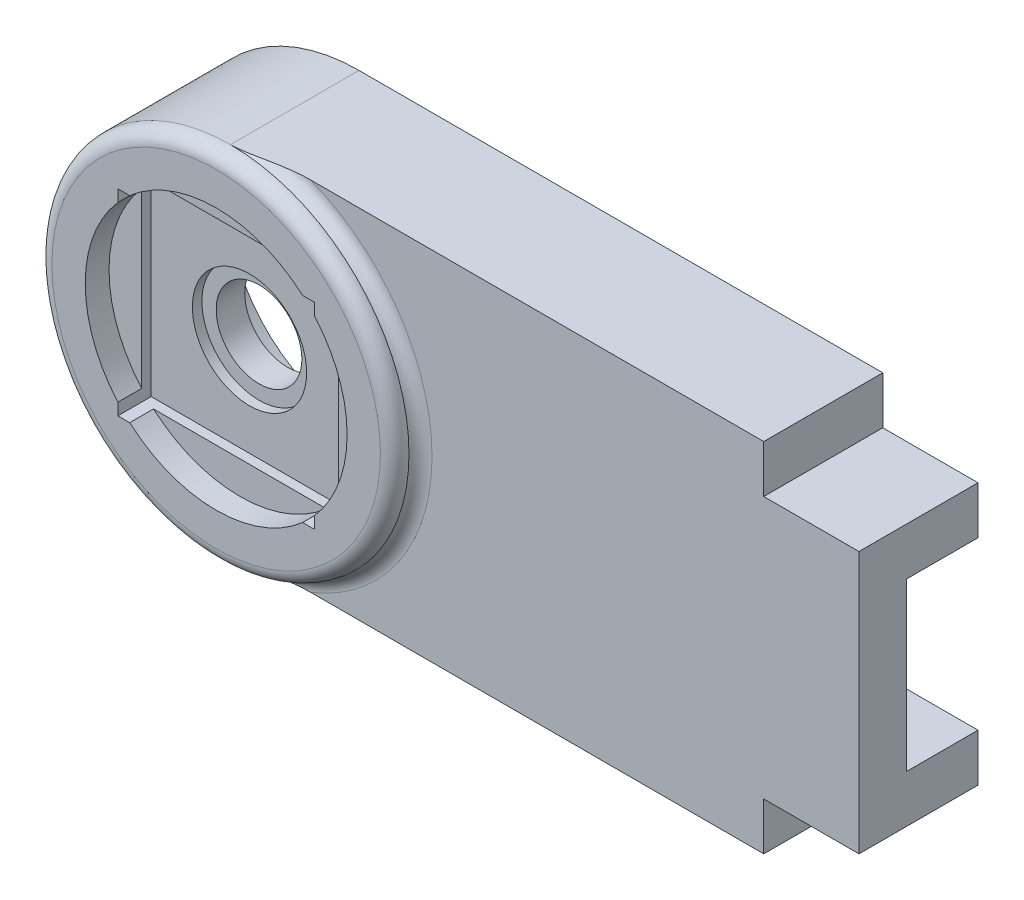
ISO-10303-21;
HEADER;
FILE_DESCRIPTION(('STEP AP214'),'2;1');
FILE_NAME('part.step','',(''),(''),'','','');
FILE_SCHEMA(('AUTOMOTIVE_DESIGN { 1 0 10303 214 1 1 1 1 }'));
ENDSEC;
DATA;
#1=APPLICATION_CONTEXT('core data for automotive mechanical design processes');
#2=APPLICATION_PROTOCOL_DEFINITION('international standard','automotive_design',2000,#1);
#3=PRODUCT_CONTEXT('',#1,'mechanical');
#4=PRODUCT('Part','Part','',(#3));
#5=PRODUCT_RELATED_PRODUCT_CATEGORY('part','',(#4));
#6=PRODUCT_DEFINITION_FORMATION('','',#4);
#7=PRODUCT_DEFINITION_CONTEXT('part definition',#1,'design');
#8=PRODUCT_DEFINITION('design','',#6,#7);
#9=PRODUCT_DEFINITION_SHAPE('','',#8);
#10=(LENGTH_UNIT() NAMED_UNIT(*) SI_UNIT(.MILLI.,.METRE.));
#11=(NAMED_UNIT(*) PLANE_ANGLE_UNIT() SI_UNIT($,.RADIAN.));
#12=(NAMED_UNIT(*) SI_UNIT($,.STERADIAN.) SOLID_ANGLE_UNIT());
#13=UNCERTAINTY_MEASURE_WITH_UNIT(LENGTH_MEASURE(1.E-05),#10,'distance_accuracy_value','');
#14=(GEOMETRIC_REPRESENTATION_CONTEXT(3) GLOBAL_UNCERTAINTY_ASSIGNED_CONTEXT((#13)) GLOBAL_UNIT_ASSIGNED_CONTEXT((#10,
#11,#12)) REPRESENTATION_CONTEXT('',''));
#15=CARTESIAN_POINT('',(0.,0.,0.));
#16=DIRECTION('',(0.,0.,1.));
#17=DIRECTION('',(1.,0.,0.));
#18=AXIS2_PLACEMENT_3D('',#15,#16,#17);
#19=CARTESIAN_POINT('',(0.,0.,30.));
#20=DIRECTION('',(0.,0.,1.));
#21=DIRECTION('',(1.,0.,0.));
#22=AXIS2_PLACEMENT_3D('',#19,#20,#21);
#23=PLANE('',#22);
#24=CARTESIAN_POINT('',(0.,0.,30.));
#25=DIRECTION('',(0.,0.,1.));
#26=DIRECTION('',(1.,0.,0.));
#27=AXIS2_PLACEMENT_3D('',#24,#25,#26);
#28=CIRCLE('',#27,34.5);
#29=CARTESIAN_POINT('',(34.5,0.,30.));
#30=VERTEX_POINT('',#29);
#31=EDGE_CURVE('E448',#30,#30,#28,.T.);
#32=ORIENTED_EDGE('',*,*,#31,.T.);
#33=EDGE_LOOP('',(#32));
#34=FACE_BOUND('',#33,.T.);
#35=DIRECTION('',(-1.,0.,0.));
#36=VECTOR('',#35,1.);
#37=CARTESIAN_POINT('',(-20.65,20.65,30.));
#38=LINE('',#37,#36);
#39=CARTESIAN_POINT('',(20.65,20.65,30.));
#40=VERTEX_POINT('',#39);
#41=CARTESIAN_POINT('',(18.1611535977206,20.65,30.));
#42=VERTEX_POINT('',#41);
#43=EDGE_CURVE('E274',#40,#42,#38,.T.);
#44=ORIENTED_EDGE('',*,*,#43,.F.);
#45=DIRECTION('',(0.,1.,0.));
#46=VECTOR('',#45,1.);
#47=CARTESIAN_POINT('',(20.65,-20.65,30.));
#48=LINE('',#47,#46);
#49=CARTESIAN_POINT('',(20.65,18.1611535977206,30.));
#50=VERTEX_POINT('',#49);
#51=EDGE_CURVE('E244',#50,#40,#48,.T.);
#52=ORIENTED_EDGE('',*,*,#51,.F.);
#53=CARTESIAN_POINT('',(0.,0.,30.));
#54=DIRECTION('',(0.,0.,1.));
#55=DIRECTION('',(1.,0.,0.));
#56=AXIS2_PLACEMENT_3D('',#53,#54,#55);
#57=CIRCLE('',#56,27.5);
#58=CARTESIAN_POINT('',(20.65,-18.1611535977206,30.));
#59=VERTEX_POINT('',#58);
#60=EDGE_CURVE('E311',#59,#50,#57,.T.);
#61=ORIENTED_EDGE('',*,*,#60,.F.);
#62=CARTESIAN_POINT('',(20.65,-20.65,30.));
#63=VERTEX_POINT('',#62);
#64=EDGE_CURVE('E271',#63,#59,#48,.T.);
#65=ORIENTED_EDGE('',*,*,#64,.F.);
#66=DIRECTION('',(1.,0.,0.));
#67=VECTOR('',#66,1.);
#68=CARTESIAN_POINT('',(-20.65,-20.65,30.));
#69=LINE('',#68,#67);
#70=CARTESIAN_POINT('',(18.1611535977206,-20.65,30.));
#71=VERTEX_POINT('',#70);
#72=EDGE_CURVE('E279',#71,#63,#69,.T.);
#73=ORIENTED_EDGE('',*,*,#72,.F.);
#74=CARTESIAN_POINT('',(-18.1611535977206,-20.65,30.));
#75=VERTEX_POINT('',#74);
#76=EDGE_CURVE('E314',#75,#71,#57,.T.);
#77=ORIENTED_EDGE('',*,*,#76,.F.);
#78=CARTESIAN_POINT('',(-20.65,-20.65,30.));
#79=VERTEX_POINT('',#78);
#80=EDGE_CURVE('E280',#79,#75,#69,.T.);
#81=ORIENTED_EDGE('',*,*,#80,.F.);
#82=DIRECTION('',(0.,-1.,0.));
#83=VECTOR('',#82,1.);
#84=CARTESIAN_POINT('',(-20.65,-20.65,30.));
#85=LINE('',#84,#83);
#86=CARTESIAN_POINT('',(-20.65,-18.1611535977206,30.));
#87=VERTEX_POINT('',#86);
#88=EDGE_CURVE('E276',#87,#79,#85,.T.);
#89=ORIENTED_EDGE('',*,*,#88,.F.);
#90=CARTESIAN_POINT('',(-20.65,18.1611535977206,30.));
#91=VERTEX_POINT('',#90);
#92=EDGE_CURVE('E939',#91,#87,#57,.T.);
#93=ORIENTED_EDGE('',*,*,#92,.F.);
#94=CARTESIAN_POINT('',(-20.65,20.65,30.));
#95=VERTEX_POINT('',#94);
#96=EDGE_CURVE('E277',#95,#91,#85,.T.);
#97=ORIENTED_EDGE('',*,*,#96,.F.);
#98=CARTESIAN_POINT('',(-18.1611535977206,20.65,30.));
#99=VERTEX_POINT('',#98);
#100=EDGE_CURVE('E273',#99,#95,#38,.T.);
#101=ORIENTED_EDGE('',*,*,#100,.F.);
#102=EDGE_CURVE('E316',#42,#99,#57,.T.);
#103=ORIENTED_EDGE('',*,*,#102,.F.);
#104=EDGE_LOOP('',(#44,#52,#61,#65,#73,#77,#81,#89,#93,#97,#101,#103));
#105=FACE_BOUND('',#104,.T.);
#106=ADVANCED_FACE('F41',(#34,#105),#23,.T.);
#107=CARTESIAN_POINT('',(0.,0.,30.));
#108=DIRECTION('',(0.,0.,-1.));
#109=DIRECTION('',(-1.,0.,0.));
#110=AXIS2_PLACEMENT_3D('',#107,#108,#109);
#111=CYLINDRICAL_SURFACE('',#110,27.5);
#112=ORIENTED_EDGE('',*,*,#60,.T.);
#113=DIRECTION('',(0.,0.,-1.));
#114=VECTOR('',#113,1.);
#115=CARTESIAN_POINT('',(20.65,18.1611535977206,30.));
#116=LINE('',#115,#114);
#117=CARTESIAN_POINT('',(20.65,18.1611535977206,25.));
#118=VERTEX_POINT('',#117);
#119=EDGE_CURVE('E307',#50,#118,#116,.T.);
#120=ORIENTED_EDGE('',*,*,#119,.T.);
#121=CARTESIAN_POINT('',(0.,0.,25.));
#122=DIRECTION('',(0.,0.,1.));
#123=DIRECTION('',(1.,0.,0.));
#124=AXIS2_PLACEMENT_3D('',#121,#122,#123);
#125=CIRCLE('',#124,27.5);
#126=CARTESIAN_POINT('',(20.65,-18.1611535977206,25.));
#127=VERTEX_POINT('',#126);
#128=EDGE_CURVE('E310',#127,#118,#125,.T.);
#129=ORIENTED_EDGE('',*,*,#128,.F.);
#130=DIRECTION('',(0.,0.,-1.));
#131=VECTOR('',#130,1.);
#132=CARTESIAN_POINT('',(20.65,-18.1611535977206,30.));
#133=LINE('',#132,#131);
#134=EDGE_CURVE('E304',#127,#59,#133,.F.);
#135=ORIENTED_EDGE('',*,*,#134,.T.);
#136=EDGE_LOOP('',(#112,#120,#129,#135));
#137=FACE_BOUND('',#136,.T.);
#138=ADVANCED_FACE('F480',(#137),#111,.F.);
#139=ORIENTED_EDGE('',*,*,#102,.T.);
#140=DIRECTION('',(0.,0.,-1.));
#141=VECTOR('',#140,1.);
#142=CARTESIAN_POINT('',(-18.1611535977206,20.65,30.));
#143=LINE('',#142,#141);
#144=CARTESIAN_POINT('',(-18.1611535977206,20.65,25.));
#145=VERTEX_POINT('',#144);
#146=EDGE_CURVE('E301',#99,#145,#143,.T.);
#147=ORIENTED_EDGE('',*,*,#146,.T.);
#148=CARTESIAN_POINT('',(18.1611535977206,20.65,25.));
#149=VERTEX_POINT('',#148);
#150=EDGE_CURVE('E315',#149,#145,#125,.T.);
#151=ORIENTED_EDGE('',*,*,#150,.F.);
#152=DIRECTION('',(0.,0.,-1.));
#153=VECTOR('',#152,1.);
#154=CARTESIAN_POINT('',(18.1611535977206,20.65,30.));
#155=LINE('',#154,#153);
#156=EDGE_CURVE('E298',#149,#42,#155,.F.);
#157=ORIENTED_EDGE('',*,*,#156,.T.);
#158=EDGE_LOOP('',(#139,#147,#151,#157));
#159=FACE_BOUND('',#158,.T.);
#160=ADVANCED_FACE('F486',(#159),#111,.F.);
#161=ORIENTED_EDGE('',*,*,#92,.T.);
#162=DIRECTION('',(0.,0.,-1.));
#163=VECTOR('',#162,1.);
#164=CARTESIAN_POINT('',(-20.65,-18.1611535977206,30.));
#165=LINE('',#164,#163);
#166=CARTESIAN_POINT('',(-20.65,-18.1611535977206,25.));
#167=VERTEX_POINT('',#166);
#168=EDGE_CURVE('E295',#87,#167,#165,.T.);
#169=ORIENTED_EDGE('',*,*,#168,.T.);
#170=CARTESIAN_POINT('',(-20.65,18.1611535977206,25.));
#171=VERTEX_POINT('',#170);
#172=EDGE_CURVE('E933',#171,#167,#125,.T.);
#173=ORIENTED_EDGE('',*,*,#172,.F.);
#174=DIRECTION('',(0.,0.,-1.));
#175=VECTOR('',#174,1.);
#176=CARTESIAN_POINT('',(-20.65,18.1611535977206,30.));
#177=LINE('',#176,#175);
#178=EDGE_CURVE('E292',#171,#91,#177,.F.);
#179=ORIENTED_EDGE('',*,*,#178,.T.);
#180=EDGE_LOOP('',(#161,#169,#173,#179));
#181=FACE_BOUND('',#180,.T.);
#182=ADVANCED_FACE('F650',(#181),#111,.F.);
#183=ORIENTED_EDGE('',*,*,#76,.T.);
#184=DIRECTION('',(0.,0.,-1.));
#185=VECTOR('',#184,1.);
#186=CARTESIAN_POINT('',(18.1611535977206,-20.65,30.));
#187=LINE('',#186,#185);
#188=CARTESIAN_POINT('',(18.1611535977206,-20.65,25.));
#189=VERTEX_POINT('',#188);
#190=EDGE_CURVE('E289',#71,#189,#187,.T.);
#191=ORIENTED_EDGE('',*,*,#190,.T.);
#192=CARTESIAN_POINT('',(-18.1611535977206,-20.65,25.));
#193=VERTEX_POINT('',#192);
#194=EDGE_CURVE('E319',#193,#189,#125,.T.);
#195=ORIENTED_EDGE('',*,*,#194,.F.);
#196=DIRECTION('',(0.,0.,-1.));
#197=VECTOR('',#196,1.);
#198=CARTESIAN_POINT('',(-18.1611535977206,-20.65,30.));
#199=LINE('',#198,#197);
#200=EDGE_CURVE('E247',#193,#75,#199,.F.);
#201=ORIENTED_EDGE('',*,*,#200,.T.);
#202=EDGE_LOOP('',(#183,#191,#195,#201));
#203=FACE_BOUND('',#202,.T.);
#204=ADVANCED_FACE('F489',(#203),#111,.F.);
#205=CARTESIAN_POINT('',(0.,0.,25.));
#206=DIRECTION('',(0.,0.,1.));
#207=DIRECTION('',(1.,0.,0.));
#208=AXIS2_PLACEMENT_3D('',#205,#206,#207);
#209=PLANE('',#208);
#210=ORIENTED_EDGE('',*,*,#128,.T.);
#211=DIRECTION('',(0.,-1.,0.));
#212=VECTOR('',#211,1.);
#213=CARTESIAN_POINT('',(20.65,0.,25.));
#214=LINE('',#213,#212);
#215=EDGE_CURVE('E445',#118,#127,#214,.T.);
#216=ORIENTED_EDGE('',*,*,#215,.T.);
#217=EDGE_LOOP('',(#210,#216));
#218=FACE_BOUND('',#217,.T.);
#219=ADVANCED_FACE('F529',(#218),#209,.T.);
#220=ORIENTED_EDGE('',*,*,#150,.T.);
#221=DIRECTION('',(1.,0.,0.));
#222=VECTOR('',#221,1.);
#223=CARTESIAN_POINT('',(0.,20.65,25.));
#224=LINE('',#223,#222);
#225=EDGE_CURVE('E442',#145,#149,#224,.T.);
#226=ORIENTED_EDGE('',*,*,#225,.T.);
#227=EDGE_LOOP('',(#220,#226));
#228=FACE_BOUND('',#227,.T.);
#229=ADVANCED_FACE('F631',(#228),#209,.T.);
#230=ORIENTED_EDGE('',*,*,#172,.T.);
#231=DIRECTION('',(0.,1.,0.));
#232=VECTOR('',#231,1.);
#233=CARTESIAN_POINT('',(-20.65,0.,25.));
#234=LINE('',#233,#232);
#235=EDGE_CURVE('E439',#167,#171,#234,.T.);
#236=ORIENTED_EDGE('',*,*,#235,.T.);
#237=EDGE_LOOP('',(#230,#236));
#238=FACE_BOUND('',#237,.T.);
#239=ADVANCED_FACE('F623',(#238),#209,.T.);
#240=ORIENTED_EDGE('',*,*,#194,.T.);
#241=DIRECTION('',(-1.,0.,0.));
#242=VECTOR('',#241,1.);
#243=CARTESIAN_POINT('',(0.,-20.65,25.));
#244=LINE('',#243,#242);
#245=EDGE_CURVE('E436',#189,#193,#244,.T.);
#246=ORIENTED_EDGE('',*,*,#245,.T.);
#247=EDGE_LOOP('',(#240,#246));
#248=FACE_BOUND('',#247,.T.);
#249=ADVANCED_FACE('F530',(#248),#209,.T.);
#250=CARTESIAN_POINT('',(130.,0.,25.));
#251=DIRECTION('',(-1.,0.,0.));
#252=DIRECTION('',(0.,0.,1.));
#253=AXIS2_PLACEMENT_3D('',#250,#251,#252);
#254=PLANE('',#253);
#255=DIRECTION('',(0.,0.,-1.));
#256=VECTOR('',#255,1.);
#257=CARTESIAN_POINT('',(130.,-17.5,15.));
#258=LINE('',#257,#256);
#259=CARTESIAN_POINT('',(130.,-17.5,15.));
#260=VERTEX_POINT('',#259);
#261=CARTESIAN_POINT('',(130.,-17.5,0.));
#262=VERTEX_POINT('',#261);
#263=EDGE_CURVE('E366',#260,#262,#258,.T.);
#264=ORIENTED_EDGE('',*,*,#263,.F.);
#265=DIRECTION('',(0.,-1.,0.));
#266=VECTOR('',#265,1.);
#267=CARTESIAN_POINT('',(130.,0.,15.));
#268=LINE('',#267,#266);
#269=CARTESIAN_POINT('',(130.,17.5,15.));
#270=VERTEX_POINT('',#269);
#271=EDGE_CURVE('E334',#270,#260,#268,.T.);
#272=ORIENTED_EDGE('',*,*,#271,.F.);
#273=DIRECTION('',(0.,0.,-1.));
#274=VECTOR('',#273,1.);
#275=CARTESIAN_POINT('',(130.,17.5,15.));
#276=LINE('',#275,#274);
#277=CARTESIAN_POINT('',(130.,17.5,0.));
#278=VERTEX_POINT('',#277);
#279=EDGE_CURVE('E368',#270,#278,#276,.T.);
#280=ORIENTED_EDGE('',*,*,#279,.T.);
#281=DIRECTION('',(0.,1.,0.));
#282=VECTOR('',#281,1.);
#283=CARTESIAN_POINT('',(130.,0.,0.));
#284=LINE('',#283,#282);
#285=CARTESIAN_POINT('',(130.,27.5,0.));
#286=VERTEX_POINT('',#285);
#287=EDGE_CURVE('E407',#278,#286,#284,.T.);
#288=ORIENTED_EDGE('',*,*,#287,.T.);
#289=DIRECTION('',(0.,0.,-1.));
#290=VECTOR('',#289,1.);
#291=CARTESIAN_POINT('',(130.,27.5,25.));
#292=LINE('',#291,#290);
#293=CARTESIAN_POINT('',(130.,27.5,25.));
#294=VERTEX_POINT('',#293);
#295=EDGE_CURVE('E419',#294,#286,#292,.T.);
#296=ORIENTED_EDGE('',*,*,#295,.F.);
#297=DIRECTION('',(0.,1.,0.));
#298=VECTOR('',#297,1.);
#299=CARTESIAN_POINT('',(130.,0.,25.));
#300=LINE('',#299,#298);
#301=CARTESIAN_POINT('',(130.,-27.5,25.));
#302=VERTEX_POINT('',#301);
#303=EDGE_CURVE('E388',#302,#294,#300,.T.);
#304=ORIENTED_EDGE('',*,*,#303,.F.);
#305=DIRECTION('',(0.,0.,-1.));
#306=VECTOR('',#305,1.);
#307=CARTESIAN_POINT('',(130.,-27.5,25.));
#308=LINE('',#307,#306);
#309=CARTESIAN_POINT('',(130.,-27.5,0.));
#310=VERTEX_POINT('',#309);
#311=EDGE_CURVE('E422',#302,#310,#308,.T.);
#312=ORIENTED_EDGE('',*,*,#311,.T.);
#313=EDGE_CURVE('E408',#310,#262,#284,.T.);
#314=ORIENTED_EDGE('',*,*,#313,.T.);
#315=EDGE_LOOP('',(#264,#272,#280,#288,#296,#304,#312,#314));
#316=FACE_BOUND('',#315,.T.);
#317=ADVANCED_FACE('F533',(#316),#254,.F.);
#318=CARTESIAN_POINT('',(0.,0.,0.));
#319=DIRECTION('',(0.,0.,1.));
#320=DIRECTION('',(1.,0.,0.));
#321=AXIS2_PLACEMENT_3D('',#318,#319,#320);
#322=PLANE('',#321);
#323=DIRECTION('',(1.,0.,0.));
#324=VECTOR('',#323,1.);
#325=CARTESIAN_POINT('',(0.,-17.5,0.));
#326=LINE('',#325,#324);
#327=CARTESIAN_POINT('',(93.2784913729705,-17.5,0.));
#328=VERTEX_POINT('',#327);
#329=EDGE_CURVE('E356',#328,#262,#326,.T.);
#330=ORIENTED_EDGE('',*,*,#329,.T.);
#331=ORIENTED_EDGE('',*,*,#313,.F.);
#332=DIRECTION('',(1.,0.,0.));
#333=VECTOR('',#332,1.);
#334=CARTESIAN_POINT('',(0.,-27.5,0.));
#335=LINE('',#334,#333);
#336=CARTESIAN_POINT('',(110.,-27.5,0.));
#337=VERTEX_POINT('',#336);
#338=EDGE_CURVE('E405',#337,#310,#335,.T.);
#339=ORIENTED_EDGE('',*,*,#338,.F.);
#340=DIRECTION('',(0.,1.,0.));
#341=VECTOR('',#340,1.);
#342=CARTESIAN_POINT('',(110.,0.,0.));
#343=LINE('',#342,#341);
#344=CARTESIAN_POINT('',(110.,-37.5,0.));
#345=VERTEX_POINT('',#344);
#346=EDGE_CURVE('E403',#345,#337,#343,.T.);
#347=ORIENTED_EDGE('',*,*,#346,.F.);
#348=DIRECTION('',(1.,0.,0.));
#349=VECTOR('',#348,1.);
#350=CARTESIAN_POINT('',(0.,-37.5,0.));
#351=LINE('',#350,#349);
#352=CARTESIAN_POINT('',(0.,-37.5,0.));
#353=VERTEX_POINT('',#352);
#354=EDGE_CURVE('E401',#353,#345,#351,.T.);
#355=ORIENTED_EDGE('',*,*,#354,.F.);
#356=CARTESIAN_POINT('',(0.,0.,0.));
#357=DIRECTION('',(0.,0.,1.));
#358=DIRECTION('',(1.,0.,0.));
#359=AXIS2_PLACEMENT_3D('',#356,#357,#358);
#360=CIRCLE('',#359,37.5);
#361=CARTESIAN_POINT('',(0.,37.5,0.));
#362=VERTEX_POINT('',#361);
#363=EDGE_CURVE('E399',#362,#353,#360,.T.);
#364=ORIENTED_EDGE('',*,*,#363,.F.);
#365=DIRECTION('',(1.,0.,0.));
#366=VECTOR('',#365,1.);
#367=CARTESIAN_POINT('',(0.,37.5,0.));
#368=LINE('',#367,#366);
#369=CARTESIAN_POINT('',(110.,37.5,0.));
#370=VERTEX_POINT('',#369);
#371=EDGE_CURVE('E363',#362,#370,#368,.T.);
#372=ORIENTED_EDGE('',*,*,#371,.T.);
#373=DIRECTION('',(0.,-1.,0.));
#374=VECTOR('',#373,1.);
#375=CARTESIAN_POINT('',(110.,0.,0.));
#376=LINE('',#375,#374);
#377=CARTESIAN_POINT('',(110.,27.5,0.));
#378=VERTEX_POINT('',#377);
#379=EDGE_CURVE('E382',#370,#378,#376,.T.);
#380=ORIENTED_EDGE('',*,*,#379,.T.);
#381=DIRECTION('',(1.,0.,0.));
#382=VECTOR('',#381,1.);
#383=CARTESIAN_POINT('',(0.,27.5,0.));
#384=LINE('',#383,#382);
#385=EDGE_CURVE('E411',#378,#286,#384,.T.);
#386=ORIENTED_EDGE('',*,*,#385,.T.);
#387=ORIENTED_EDGE('',*,*,#287,.F.);
#388=DIRECTION('',(1.,0.,0.));
#389=VECTOR('',#388,1.);
#390=CARTESIAN_POINT('',(0.,17.5,0.));
#391=LINE('',#390,#389);
#392=CARTESIAN_POINT('',(93.2784913729705,17.5,0.));
#393=VERTEX_POINT('',#392);
#394=EDGE_CURVE('E354',#393,#278,#391,.T.);
#395=ORIENTED_EDGE('',*,*,#394,.F.);
#396=DIRECTION('',(0.,1.,0.));
#397=VECTOR('',#396,1.);
#398=CARTESIAN_POINT('',(93.2784913729705,0.,0.));
#399=LINE('',#398,#397);
#400=CARTESIAN_POINT('',(93.2784913729705,27.5,0.));
#401=VERTEX_POINT('',#400);
#402=EDGE_CURVE('E351',#393,#401,#399,.T.);
#403=ORIENTED_EDGE('',*,*,#402,.T.);
#404=DIRECTION('',(-1.,0.,0.));
#405=VECTOR('',#404,1.);
#406=CARTESIAN_POINT('',(0.,27.5,0.));
#407=LINE('',#406,#405);
#408=CARTESIAN_POINT('',(0.,27.5,0.));
#409=VERTEX_POINT('',#408);
#410=EDGE_CURVE('E348',#401,#409,#407,.T.);
#411=ORIENTED_EDGE('',*,*,#410,.T.);
#412=CARTESIAN_POINT('',(0.,0.,0.));
#413=DIRECTION('',(0.,0.,-1.));
#414=DIRECTION('',(-1.,0.,0.));
#415=AXIS2_PLACEMENT_3D('',#412,#413,#414);
#416=CIRCLE('',#415,27.5);
#417=CARTESIAN_POINT('',(0.,-27.5,0.));
#418=VERTEX_POINT('',#417);
#419=EDGE_CURVE('E345',#418,#409,#416,.T.);
#420=ORIENTED_EDGE('',*,*,#419,.F.);
#421=DIRECTION('',(-1.,0.,0.));
#422=VECTOR('',#421,1.);
#423=CARTESIAN_POINT('',(0.,-27.5,0.));
#424=LINE('',#423,#422);
#425=CARTESIAN_POINT('',(93.2784913729705,-27.5,0.));
#426=VERTEX_POINT('',#425);
#427=EDGE_CURVE('E343',#426,#418,#424,.T.);
#428=ORIENTED_EDGE('',*,*,#427,.F.);
#429=DIRECTION('',(0.,-1.,0.));
#430=VECTOR('',#429,1.);
#431=CARTESIAN_POINT('',(93.2784913729705,0.,0.));
#432=LINE('',#431,#430);
#433=EDGE_CURVE('E324',#328,#426,#432,.T.);
#434=ORIENTED_EDGE('',*,*,#433,.F.);
#435=EDGE_LOOP('',(#330,#331,#339,#347,#355,#364,#372,#380,#386,#387,#395,#403,#411,#420,#428,#434));
#436=FACE_BOUND('',#435,.T.);
#437=ADVANCED_FACE('F464',(#436),#322,.F.);
#438=CARTESIAN_POINT('',(0.,37.5,25.));
#439=DIRECTION('',(0.,1.,0.));
#440=DIRECTION('',(-1.,0.,0.));
#441=AXIS2_PLACEMENT_3D('',#438,#439,#440);
#442=PLANE('',#441);
#443=ORIENTED_EDGE('',*,*,#371,.F.);
#444=DIRECTION('',(0.,0.,-1.));
#445=VECTOR('',#444,1.);
#446=CARTESIAN_POINT('',(0.,37.5,25.));
#447=LINE('',#446,#445);
#448=CARTESIAN_POINT('',(0.,37.5,27.));
#449=VERTEX_POINT('',#448);
#450=EDGE_CURVE('E434',#449,#362,#447,.T.);
#451=ORIENTED_EDGE('',*,*,#450,.F.);
#452=CARTESIAN_POINT('',(0.,37.5,27.));
#453=CARTESIAN_POINT('',(0.126964958034356,37.5,27.0000241727563));
#454=CARTESIAN_POINT('',(0.25392489725668,37.5,26.9981765764675));
#455=CARTESIAN_POINT('',(0.507721254466847,37.5,26.9909186121942));
#456=CARTESIAN_POINT('',(0.634557690329701,37.5,26.9855088743921));
#457=CARTESIAN_POINT('',(0.887879385580948,37.5,26.971316190933));
#458=CARTESIAN_POINT('',(1.01436488594792,37.5,26.9625374895175));
#459=CARTESIAN_POINT('',(1.26708875439398,37.5,26.9419211269181));
#460=CARTESIAN_POINT('',(1.39332711071027,37.5,26.9300833235392));
#461=CARTESIAN_POINT('',(1.770766185565,37.5,26.8906148384615));
#462=CARTESIAN_POINT('',(2.02154845620435,37.5,26.8589762546335));
#463=CARTESIAN_POINT('',(2.52201407534946,37.5,26.7879974706273));
#464=CARTESIAN_POINT('',(2.77169726830816,37.5,26.7486562140256));
#465=CARTESIAN_POINT('',(3.27009042281657,37.5,26.6648865159639));
#466=CARTESIAN_POINT('',(3.51880074289227,37.5,26.6204601766811));
#467=CARTESIAN_POINT('',(4.0156088464877,37.5,26.5285038337744));
#468=CARTESIAN_POINT('',(4.26370669786256,37.5,26.4809741916016));
#469=CARTESIAN_POINT('',(4.75987815313978,37.5,26.3842461450559));
#470=CARTESIAN_POINT('',(5.007951383345,37.5,26.3350458386594));
#471=CARTESIAN_POINT('',(5.50400147970555,37.5,26.236170017078));
#472=CARTESIAN_POINT('',(5.75197834597351,37.5,26.1864945024504));
#473=CARTESIAN_POINT('',(6.36431603926136,37.5,26.0643876456565));
#474=CARTESIAN_POINT('',(6.728728714026,37.5,25.9922078275736));
#475=CARTESIAN_POINT('',(7.45816353191382,37.5,25.8510775703508));
#476=CARTESIAN_POINT('',(7.82318566015714,37.5,25.7821270535276));
#477=CARTESIAN_POINT('',(8.91898998745693,37.5,25.5830939214297));
#478=CARTESIAN_POINT('',(9.65124633378456,37.5,25.460674544682));
#479=CARTESIAN_POINT('',(10.7541209749748,37.5,25.302961450623));
#480=CARTESIAN_POINT('',(11.1228690058357,37.5,25.2546741102408));
#481=CARTESIAN_POINT('',(11.8615607442197,37.5,25.1687428689242));
#482=CARTESIAN_POINT('',(12.2315042509846,37.5,25.1310972661956));
#483=CARTESIAN_POINT('',(12.9735330504083,37.5,25.0685336775709));
#484=CARTESIAN_POINT('',(13.3456214357148,37.5,25.0436510305308));
#485=CARTESIAN_POINT('',(13.904388199767,37.5,25.0179559297192));
#486=CARTESIAN_POINT('',(14.0908043820616,37.5,25.0113288041689));
#487=CARTESIAN_POINT('',(14.4637581153145,37.5,25.0023543165655));
#488=CARTESIAN_POINT('',(14.6502956770965,37.5,25.0000074110248));
#489=CARTESIAN_POINT('',(14.8368471838179,37.5,25.));
#490=B_SPLINE_CURVE_WITH_KNOTS('',3,(#452,#453,#454,#455,#456,#457,#458,#459,#460,#461,#462,
#463,#464,#465,#466,#467,#468,#469,#470,#471,#472,#473,#474,#475,#476,#477,#478,#479,#480,#481,
#482,#483,#484,#485,#486,#487,#488,#489),.UNSPECIFIED.,.F.,.F.,(4,2,2,2,2,2,2,2,2,2,2,2,2,2,2,2,
2,2,4),(0.,0.380873332337587,0.761679302040282,1.14200709657276,1.52235257291137,
2.28046840558012,3.0386882869685,3.79659584410962,4.55441528239082,5.31312849223086,
6.07184081274041,7.18630426002195,8.30074088427303,10.5273573186106,11.6429217734111,
12.7583077294945,13.8767655857452,14.4363236122891,14.995941315729),.UNSPECIFIED.);
#491=CARTESIAN_POINT('',(14.8368471838179,37.5,25.));
#492=VERTEX_POINT('',#491);
#493=EDGE_CURVE('E54',#449,#492,#490,.T.);
#494=ORIENTED_EDGE('',*,*,#493,.T.);
#495=DIRECTION('',(1.,0.,0.));
#496=VECTOR('',#495,1.);
#497=CARTESIAN_POINT('',(0.,37.5,25.));
#498=LINE('',#497,#496);
#499=CARTESIAN_POINT('',(110.,37.5,25.));
#500=VERTEX_POINT('',#499);
#501=EDGE_CURVE('E379',#492,#500,#498,.T.);
#502=ORIENTED_EDGE('',*,*,#501,.T.);
#503=DIRECTION('',(0.,0.,-1.));
#504=VECTOR('',#503,1.);
#505=CARTESIAN_POINT('',(110.,37.5,25.));
#506=LINE('',#505,#504);
#507=EDGE_CURVE('E396',#500,#370,#506,.T.);
#508=ORIENTED_EDGE('',*,*,#507,.T.);
#509=EDGE_LOOP('',(#443,#451,#494,#502,#508));
#510=FACE_BOUND('',#509,.T.);
#511=ADVANCED_FACE('F459',(#510),#442,.T.);
#512=CARTESIAN_POINT('',(0.,0.,25.));
#513=DIRECTION('',(0.,0.,-1.));
#514=DIRECTION('',(-1.,0.,0.));
#515=AXIS2_PLACEMENT_3D('',#512,#513,#514);
#516=CYLINDRICAL_SURFACE('',#515,37.5);
#517=CARTESIAN_POINT('',(0.,0.,27.));
#518=DIRECTION('',(0.,0.,1.));
#519=DIRECTION('',(1.,0.,0.));
#520=AXIS2_PLACEMENT_3D('',#517,#518,#519);
#521=CIRCLE('',#520,37.5);
#522=CARTESIAN_POINT('',(0.,-37.5,27.));
#523=VERTEX_POINT('',#522);
#524=EDGE_CURVE('E452',#523,#449,#521,.F.);
#525=ORIENTED_EDGE('',*,*,#524,.T.);
#526=ORIENTED_EDGE('',*,*,#450,.T.);
#527=ORIENTED_EDGE('',*,*,#363,.T.);
#528=DIRECTION('',(0.,0.,-1.));
#529=VECTOR('',#528,1.);
#530=CARTESIAN_POINT('',(0.,-37.5,25.));
#531=LINE('',#530,#529);
#532=EDGE_CURVE('E431',#523,#353,#531,.T.);
#533=ORIENTED_EDGE('',*,*,#532,.F.);
#534=EDGE_LOOP('',(#525,#526,#527,#533));
#535=FACE_BOUND('',#534,.T.);
#536=ADVANCED_FACE('F463',(#535),#516,.T.);
#537=CARTESIAN_POINT('',(0.,-37.5,25.));
#538=DIRECTION('',(0.,1.,0.));
#539=DIRECTION('',(-1.,0.,0.));
#540=AXIS2_PLACEMENT_3D('',#537,#538,#539);
#541=PLANE('',#540);
#542=ORIENTED_EDGE('',*,*,#354,.T.);
#543=DIRECTION('',(0.,0.,-1.));
#544=VECTOR('',#543,1.);
#545=CARTESIAN_POINT('',(110.,-37.5,25.));
#546=LINE('',#545,#544);
#547=CARTESIAN_POINT('',(110.,-37.5,25.));
#548=VERTEX_POINT('',#547);
#549=EDGE_CURVE('E428',#548,#345,#546,.T.);
#550=ORIENTED_EDGE('',*,*,#549,.F.);
#551=DIRECTION('',(1.,0.,0.));
#552=VECTOR('',#551,1.);
#553=CARTESIAN_POINT('',(0.,-37.5,25.));
#554=LINE('',#553,#552);
#555=CARTESIAN_POINT('',(14.8368471838179,-37.5,25.));
#556=VERTEX_POINT('',#555);
#557=EDGE_CURVE('E381',#556,#548,#554,.T.);
#558=ORIENTED_EDGE('',*,*,#557,.F.);
#559=CARTESIAN_POINT('',(14.8368471838179,-37.5,25.));
#560=CARTESIAN_POINT('',(14.5849230652565,-37.5,25.0000269612687));
#561=CARTESIAN_POINT('',(14.3330307629082,-37.5,25.0042940056299));
#562=CARTESIAN_POINT('',(13.8295402055221,-37.5,25.020383578982));
#563=CARTESIAN_POINT('',(13.5779418967304,-37.5,25.0322043932898));
#564=CARTESIAN_POINT('',(13.075378451498,-37.5,25.0624642360844));
#565=CARTESIAN_POINT('',(12.824412951225,-37.5,25.0808973792909));
#566=CARTESIAN_POINT('',(12.3229712227142,-37.5,25.1236194626027));
#567=CARTESIAN_POINT('',(12.0724950268505,-37.5,25.1479087777727));
#568=CARTESIAN_POINT('',(11.3225471619507,-37.5,25.2284347654649));
#569=CARTESIAN_POINT('',(10.823898402507,-37.5,25.2923728482167));
#570=CARTESIAN_POINT('',(9.82878475723495,-37.5,25.4359738253076));
#571=CARTESIAN_POINT('',(9.33232058106027,-37.5,25.5156414920178));
#572=CARTESIAN_POINT('',(8.4695457832236,-37.5,25.6642290571408));
#573=CARTESIAN_POINT('',(8.10278886177347,-37.5,25.7305980183705));
#574=CARTESIAN_POINT('',(7.3701187058454,-37.5,25.8677311951615));
#575=CARTESIAN_POINT('',(7.00420543900366,-37.5,25.9384952391105));
#576=CARTESIAN_POINT('',(6.27305773269619,-37.5,26.0823376874123));
#577=CARTESIAN_POINT('',(5.90782302369269,-37.5,26.1554147358259));
#578=CARTESIAN_POINT('',(5.17723467900755,-37.5,26.3013993964057));
#579=CARTESIAN_POINT('',(4.81188103529987,-37.5,26.3743069657101));
#580=CARTESIAN_POINT('',(4.07963350968543,-37.5,26.5166189514854));
#581=CARTESIAN_POINT('',(3.71273800763958,-37.5,26.5860153040066));
#582=CARTESIAN_POINT('',(3.16130852696724,-37.5,26.6833012485213));
#583=CARTESIAN_POINT('',(2.97737994542636,-37.5,26.7145857178612));
#584=CARTESIAN_POINT('',(2.6089946069933,-37.5,26.7739601134456));
#585=CARTESIAN_POINT('',(2.42453782904076,-37.5,26.8020499104406));
#586=CARTESIAN_POINT('',(2.05448364833078,-37.5,26.854034411697));
#587=CARTESIAN_POINT('',(1.86888449072194,-37.5,26.8779168116197));
#588=CARTESIAN_POINT('',(1.497077946062,-37.5,26.9201725151638));
#589=CARTESIAN_POINT('',(1.31087065917405,-37.5,26.9385466839194));
#590=CARTESIAN_POINT('',(0.937437646832221,-37.5,26.9685980817353));
#591=CARTESIAN_POINT('',(0.750210541983856,-37.5,26.9802586652765));
#592=CARTESIAN_POINT('',(0.37533321927708,-37.5,26.9960133507584));
#593=CARTESIAN_POINT('',(0.187682817270886,-37.5,27.0001029962139));
#594=CARTESIAN_POINT('',(0.,-37.5,27.));
#595=B_SPLINE_CURVE_WITH_KNOTS('',3,(#559,#560,#561,#562,#563,#564,#565,#566,#567,#568,#569,
#570,#571,#572,#573,#574,#575,#576,#577,#578,#579,#580,#581,#582,#583,#584,#585,#586,#587,#588,
#589,#590,#591,#592,#593,#594),.UNSPECIFIED.,.F.,.F.,(4,2,2,2,2,2,2,2,2,2,2,2,2,2,2,2,2,4),(0.,
0.755691019866511,1.51121056104227,2.26605931638484,3.02095642965993,4.52877461677757,
6.03705098235088,7.15515747331824,8.27322033363224,9.39063947453461,10.5083157625631,
11.6284521486503,12.1881425304166,12.747855547974,13.3091791879855,13.8704146190907,
14.4330356385037,14.9959877286434),.UNSPECIFIED.);
#596=EDGE_CURVE('E11',#556,#523,#595,.T.);
#597=ORIENTED_EDGE('',*,*,#596,.T.);
#598=ORIENTED_EDGE('',*,*,#532,.T.);
#599=EDGE_LOOP('',(#542,#550,#558,#597,#598));
#600=FACE_BOUND('',#599,.T.);
#601=ADVANCED_FACE('F551',(#600),#541,.F.);
#602=CARTESIAN_POINT('',(110.,0.,25.));
#603=DIRECTION('',(-1.,0.,0.));
#604=DIRECTION('',(0.,0.,1.));
#605=AXIS2_PLACEMENT_3D('',#602,#603,#604);
#606=PLANE('',#605);
#607=ORIENTED_EDGE('',*,*,#346,.T.);
#608=DIRECTION('',(0.,0.,-1.));
#609=VECTOR('',#608,1.);
#610=CARTESIAN_POINT('',(110.,-27.5,25.));
#611=LINE('',#610,#609);
#612=CARTESIAN_POINT('',(110.,-27.5,25.));
#613=VERTEX_POINT('',#612);
#614=EDGE_CURVE('E425',#613,#337,#611,.T.);
#615=ORIENTED_EDGE('',*,*,#614,.F.);
#616=DIRECTION('',(0.,1.,0.));
#617=VECTOR('',#616,1.);
#618=CARTESIAN_POINT('',(110.,0.,25.));
#619=LINE('',#618,#617);
#620=EDGE_CURVE('E384',#548,#613,#619,.T.);
#621=ORIENTED_EDGE('',*,*,#620,.F.);
#622=ORIENTED_EDGE('',*,*,#549,.T.);
#623=EDGE_LOOP('',(#607,#615,#621,#622));
#624=FACE_BOUND('',#623,.T.);
#625=ADVANCED_FACE('F548',(#624),#606,.F.);
#626=CARTESIAN_POINT('',(0.,-27.5,25.));
#627=DIRECTION('',(0.,1.,0.));
#628=DIRECTION('',(0.,0.,1.));
#629=AXIS2_PLACEMENT_3D('',#626,#627,#628);
#630=PLANE('',#629);
#631=ORIENTED_EDGE('',*,*,#338,.T.);
#632=ORIENTED_EDGE('',*,*,#311,.F.);
#633=DIRECTION('',(1.,0.,0.));
#634=VECTOR('',#633,1.);
#635=CARTESIAN_POINT('',(0.,-27.5,25.));
#636=LINE('',#635,#634);
#637=EDGE_CURVE('E386',#613,#302,#636,.T.);
#638=ORIENTED_EDGE('',*,*,#637,.F.);
#639=ORIENTED_EDGE('',*,*,#614,.T.);
#640=EDGE_LOOP('',(#631,#632,#638,#639));
#641=FACE_BOUND('',#640,.T.);
#642=ADVANCED_FACE('F541',(#641),#630,.F.);
#643=CARTESIAN_POINT('',(0.,27.5,25.));
#644=DIRECTION('',(0.,1.,0.));
#645=DIRECTION('',(0.,0.,1.));
#646=AXIS2_PLACEMENT_3D('',#643,#644,#645);
#647=PLANE('',#646);
#648=ORIENTED_EDGE('',*,*,#385,.F.);
#649=DIRECTION('',(0.,0.,-1.));
#650=VECTOR('',#649,1.);
#651=CARTESIAN_POINT('',(110.,27.5,25.));
#652=LINE('',#651,#650);
#653=CARTESIAN_POINT('',(110.,27.5,25.));
#654=VERTEX_POINT('',#653);
#655=EDGE_CURVE('E417',#654,#378,#652,.T.);
#656=ORIENTED_EDGE('',*,*,#655,.F.);
#657=DIRECTION('',(1.,0.,0.));
#658=VECTOR('',#657,1.);
#659=CARTESIAN_POINT('',(0.,27.5,25.));
#660=LINE('',#659,#658);
#661=EDGE_CURVE('E390',#654,#294,#660,.T.);
#662=ORIENTED_EDGE('',*,*,#661,.T.);
#663=ORIENTED_EDGE('',*,*,#295,.T.);
#664=EDGE_LOOP('',(#648,#656,#662,#663));
#665=FACE_BOUND('',#664,.T.);
#666=ADVANCED_FACE('F537',(#665),#647,.T.);
#667=CARTESIAN_POINT('',(110.,0.,25.));
#668=DIRECTION('',(1.,0.,0.));
#669=DIRECTION('',(0.,0.,-1.));
#670=AXIS2_PLACEMENT_3D('',#667,#668,#669);
#671=PLANE('',#670);
#672=ORIENTED_EDGE('',*,*,#379,.F.);
#673=ORIENTED_EDGE('',*,*,#507,.F.);
#674=DIRECTION('',(0.,-1.,0.));
#675=VECTOR('',#674,1.);
#676=CARTESIAN_POINT('',(110.,0.,25.));
#677=LINE('',#676,#675);
#678=EDGE_CURVE('E393',#500,#654,#677,.T.);
#679=ORIENTED_EDGE('',*,*,#678,.T.);
#680=ORIENTED_EDGE('',*,*,#655,.T.);
#681=EDGE_LOOP('',(#672,#673,#679,#680));
#682=FACE_BOUND('',#681,.T.);
#683=ADVANCED_FACE('F528',(#682),#671,.T.);
#684=ORIENTED_EDGE('',*,*,#501,.F.);
#685=CARTESIAN_POINT('',(0.,0.,25.));
#686=DIRECTION('',(0.,0.,1.));
#687=DIRECTION('',(1.,0.,0.));
#688=AXIS2_PLACEMENT_3D('',#685,#686,#687);
#689=CIRCLE('',#688,40.3284271247462);
#690=EDGE_CURVE('E67',#492,#556,#689,.F.);
#691=ORIENTED_EDGE('',*,*,#690,.T.);
#692=ORIENTED_EDGE('',*,*,#557,.T.);
#693=ORIENTED_EDGE('',*,*,#620,.T.);
#694=ORIENTED_EDGE('',*,*,#637,.T.);
#695=ORIENTED_EDGE('',*,*,#303,.T.);
#696=ORIENTED_EDGE('',*,*,#661,.F.);
#697=ORIENTED_EDGE('',*,*,#678,.F.);
#698=EDGE_LOOP('',(#684,#691,#692,#693,#694,#695,#696,#697));
#699=FACE_BOUND('',#698,.T.);
#700=ADVANCED_FACE('F524',(#699),#209,.T.);
#701=CARTESIAN_POINT('',(0.,-27.5,15.));
#702=DIRECTION('',(0.,-1.,0.));
#703=DIRECTION('',(0.,0.,-1.));
#704=AXIS2_PLACEMENT_3D('',#701,#702,#703);
#705=PLANE('',#704);
#706=ORIENTED_EDGE('',*,*,#427,.T.);
#707=DIRECTION('',(0.,0.,-1.));
#708=VECTOR('',#707,1.);
#709=CARTESIAN_POINT('',(0.,-27.5,15.));
#710=LINE('',#709,#708);
#711=CARTESIAN_POINT('',(0.,-27.5,15.));
#712=VERTEX_POINT('',#711);
#713=EDGE_CURVE('E342',#712,#418,#710,.T.);
#714=ORIENTED_EDGE('',*,*,#713,.F.);
#715=DIRECTION('',(-1.,0.,0.));
#716=VECTOR('',#715,1.);
#717=CARTESIAN_POINT('',(0.,-27.5,15.));
#718=LINE('',#717,#716);
#719=CARTESIAN_POINT('',(93.2784913729705,-27.5,15.));
#720=VERTEX_POINT('',#719);
#721=EDGE_CURVE('E320',#720,#712,#718,.T.);
#722=ORIENTED_EDGE('',*,*,#721,.F.);
#723=DIRECTION('',(0.,0.,-1.));
#724=VECTOR('',#723,1.);
#725=CARTESIAN_POINT('',(93.2784913729705,-27.5,15.));
#726=LINE('',#725,#724);
#727=EDGE_CURVE('E361',#720,#426,#726,.T.);
#728=ORIENTED_EDGE('',*,*,#727,.T.);
#729=EDGE_LOOP('',(#706,#714,#722,#728));
#730=FACE_BOUND('',#729,.T.);
#731=ADVANCED_FACE('F502',(#730),#705,.F.);
#732=CARTESIAN_POINT('',(93.2784913729705,0.,15.));
#733=DIRECTION('',(1.,0.,0.));
#734=DIRECTION('',(0.,0.,-1.));
#735=AXIS2_PLACEMENT_3D('',#732,#733,#734);
#736=PLANE('',#735);
#737=ORIENTED_EDGE('',*,*,#433,.T.);
#738=ORIENTED_EDGE('',*,*,#727,.F.);
#739=DIRECTION('',(0.,-1.,0.));
#740=VECTOR('',#739,1.);
#741=CARTESIAN_POINT('',(93.2784913729705,0.,15.));
#742=LINE('',#741,#740);
#743=CARTESIAN_POINT('',(93.2784913729705,-17.5,15.));
#744=VERTEX_POINT('',#743);
#745=EDGE_CURVE('E339',#744,#720,#742,.T.);
#746=ORIENTED_EDGE('',*,*,#745,.F.);
#747=DIRECTION('',(0.,0.,-1.));
#748=VECTOR('',#747,1.);
#749=CARTESIAN_POINT('',(93.2784913729705,-17.5,15.));
#750=LINE('',#749,#748);
#751=EDGE_CURVE('E364',#744,#328,#750,.T.);
#752=ORIENTED_EDGE('',*,*,#751,.T.);
#753=EDGE_LOOP('',(#737,#738,#746,#752));
#754=FACE_BOUND('',#753,.T.);
#755=ADVANCED_FACE('F498',(#754),#736,.F.);
#756=CARTESIAN_POINT('',(0.,-17.5,15.));
#757=DIRECTION('',(0.,1.,0.));
#758=DIRECTION('',(-1.,0.,0.));
#759=AXIS2_PLACEMENT_3D('',#756,#757,#758);
#760=PLANE('',#759);
#761=ORIENTED_EDGE('',*,*,#329,.F.);
#762=ORIENTED_EDGE('',*,*,#751,.F.);
#763=DIRECTION('',(1.,0.,0.));
#764=VECTOR('',#763,1.);
#765=CARTESIAN_POINT('',(0.,-17.5,15.));
#766=LINE('',#765,#764);
#767=EDGE_CURVE('E337',#744,#260,#766,.T.);
#768=ORIENTED_EDGE('',*,*,#767,.T.);
#769=ORIENTED_EDGE('',*,*,#263,.T.);
#770=EDGE_LOOP('',(#761,#762,#768,#769));
#771=FACE_BOUND('',#770,.T.);
#772=ADVANCED_FACE('F501',(#771),#760,.T.);
#773=CARTESIAN_POINT('',(0.,17.5,15.));
#774=DIRECTION('',(0.,1.,0.));
#775=DIRECTION('',(-1.,0.,0.));
#776=AXIS2_PLACEMENT_3D('',#773,#774,#775);
#777=PLANE('',#776);
#778=ORIENTED_EDGE('',*,*,#394,.T.);
#779=ORIENTED_EDGE('',*,*,#279,.F.);
#780=DIRECTION('',(1.,0.,0.));
#781=VECTOR('',#780,1.);
#782=CARTESIAN_POINT('',(0.,17.5,15.));
#783=LINE('',#782,#781);
#784=CARTESIAN_POINT('',(93.2784913729705,17.5,15.));
#785=VERTEX_POINT('',#784);
#786=EDGE_CURVE('E331',#785,#270,#783,.T.);
#787=ORIENTED_EDGE('',*,*,#786,.F.);
#788=DIRECTION('',(0.,0.,-1.));
#789=VECTOR('',#788,1.);
#790=CARTESIAN_POINT('',(93.2784913729705,17.5,15.));
#791=LINE('',#790,#789);
#792=EDGE_CURVE('E371',#785,#393,#791,.T.);
#793=ORIENTED_EDGE('',*,*,#792,.T.);
#794=EDGE_LOOP('',(#778,#779,#787,#793));
#795=FACE_BOUND('',#794,.T.);
#796=ADVANCED_FACE('F506',(#795),#777,.F.);
#797=CARTESIAN_POINT('',(93.2784913729705,0.,15.));
#798=DIRECTION('',(-1.,0.,0.));
#799=DIRECTION('',(0.,0.,1.));
#800=AXIS2_PLACEMENT_3D('',#797,#798,#799);
#801=PLANE('',#800);
#802=ORIENTED_EDGE('',*,*,#402,.F.);
#803=ORIENTED_EDGE('',*,*,#792,.F.);
#804=DIRECTION('',(0.,1.,0.));
#805=VECTOR('',#804,1.);
#806=CARTESIAN_POINT('',(93.2784913729705,0.,15.));
#807=LINE('',#806,#805);
#808=CARTESIAN_POINT('',(93.2784913729705,27.5,15.));
#809=VERTEX_POINT('',#808);
#810=EDGE_CURVE('E329',#785,#809,#807,.T.);
#811=ORIENTED_EDGE('',*,*,#810,.T.);
#812=DIRECTION('',(0.,0.,-1.));
#813=VECTOR('',#812,1.);
#814=CARTESIAN_POINT('',(93.2784913729705,27.5,15.));
#815=LINE('',#814,#813);
#816=EDGE_CURVE('E373',#809,#401,#815,.T.);
#817=ORIENTED_EDGE('',*,*,#816,.T.);
#818=EDGE_LOOP('',(#802,#803,#811,#817));
#819=FACE_BOUND('',#818,.T.);
#820=ADVANCED_FACE('F510',(#819),#801,.T.);
#821=CARTESIAN_POINT('',(0.,27.5,15.));
#822=DIRECTION('',(0.,-1.,0.));
#823=DIRECTION('',(0.,0.,-1.));
#824=AXIS2_PLACEMENT_3D('',#821,#822,#823);
#825=PLANE('',#824);
#826=ORIENTED_EDGE('',*,*,#410,.F.);
#827=ORIENTED_EDGE('',*,*,#816,.F.);
#828=DIRECTION('',(-1.,0.,0.));
#829=VECTOR('',#828,1.);
#830=CARTESIAN_POINT('',(0.,27.5,15.));
#831=LINE('',#830,#829);
#832=CARTESIAN_POINT('',(0.,27.5,15.));
#833=VERTEX_POINT('',#832);
#834=EDGE_CURVE('E327',#809,#833,#831,.T.);
#835=ORIENTED_EDGE('',*,*,#834,.T.);
#836=DIRECTION('',(0.,0.,-1.));
#837=VECTOR('',#836,1.);
#838=CARTESIAN_POINT('',(0.,27.5,15.));
#839=LINE('',#838,#837);
#840=EDGE_CURVE('E375',#833,#409,#839,.T.);
#841=ORIENTED_EDGE('',*,*,#840,.T.);
#842=EDGE_LOOP('',(#826,#827,#835,#841));
#843=FACE_BOUND('',#842,.T.);
#844=ADVANCED_FACE('F514',(#843),#825,.T.);
#845=CARTESIAN_POINT('',(0.,0.,15.));
#846=DIRECTION('',(0.,0.,-1.));
#847=DIRECTION('',(-1.,0.,0.));
#848=AXIS2_PLACEMENT_3D('',#845,#846,#847);
#849=CYLINDRICAL_SURFACE('',#848,27.5);
#850=ORIENTED_EDGE('',*,*,#419,.T.);
#851=ORIENTED_EDGE('',*,*,#840,.F.);
#852=CARTESIAN_POINT('',(0.,0.,15.));
#853=DIRECTION('',(0.,0.,-1.));
#854=DIRECTION('',(-1.,0.,0.));
#855=AXIS2_PLACEMENT_3D('',#852,#853,#854);
#856=CIRCLE('',#855,27.5);
#857=EDGE_CURVE('E323',#712,#833,#856,.T.);
#858=ORIENTED_EDGE('',*,*,#857,.F.);
#859=ORIENTED_EDGE('',*,*,#713,.T.);
#860=EDGE_LOOP('',(#850,#851,#858,#859));
#861=FACE_BOUND('',#860,.T.);
#862=ADVANCED_FACE('F496',(#861),#849,.F.);
#863=CARTESIAN_POINT('',(0.,0.,15.));
#864=DIRECTION('',(0.,0.,-1.));
#865=DIRECTION('',(-1.,0.,0.));
#866=AXIS2_PLACEMENT_3D('',#863,#864,#865);
#867=PLANE('',#866);
#868=CARTESIAN_POINT('',(0.,0.,15.));
#869=DIRECTION('',(0.,0.,-1.));
#870=DIRECTION('',(-1.,0.,0.));
#871=AXIS2_PLACEMENT_3D('',#868,#869,#870);
#872=CIRCLE('',#871,9.);
#873=CARTESIAN_POINT('',(-9.,0.,15.));
#874=VERTEX_POINT('',#873);
#875=EDGE_CURVE('E907',#874,#874,#872,.T.);
#876=ORIENTED_EDGE('',*,*,#875,.F.);
#877=EDGE_LOOP('',(#876));
#878=FACE_BOUND('',#877,.T.);
#879=ORIENTED_EDGE('',*,*,#721,.T.);
#880=ORIENTED_EDGE('',*,*,#857,.T.);
#881=ORIENTED_EDGE('',*,*,#834,.F.);
#882=ORIENTED_EDGE('',*,*,#810,.F.);
#883=ORIENTED_EDGE('',*,*,#786,.T.);
#884=ORIENTED_EDGE('',*,*,#271,.T.);
#885=ORIENTED_EDGE('',*,*,#767,.F.);
#886=ORIENTED_EDGE('',*,*,#745,.T.);
#887=EDGE_LOOP('',(#879,#880,#881,#882,#883,#884,#885,#886));
#888=FACE_BOUND('',#887,.T.);
#889=ADVANCED_FACE('F493',(#878,#888),#867,.T.);
#890=CARTESIAN_POINT('',(20.65,-20.65,30.));
#891=DIRECTION('',(-1.,0.,0.));
#892=DIRECTION('',(0.,0.,1.));
#893=AXIS2_PLACEMENT_3D('',#890,#891,#892);
#894=PLANE('',#893);
#895=ORIENTED_EDGE('',*,*,#51,.T.);
#896=DIRECTION('',(0.,0.,-1.));
#897=VECTOR('',#896,1.);
#898=CARTESIAN_POINT('',(20.65,20.65,30.));
#899=LINE('',#898,#897);
#900=CARTESIAN_POINT('',(20.65,20.65,23.));
#901=VERTEX_POINT('',#900);
#902=EDGE_CURVE('E236',#40,#901,#899,.T.);
#903=ORIENTED_EDGE('',*,*,#902,.T.);
#904=DIRECTION('',(0.,1.,0.));
#905=VECTOR('',#904,1.);
#906=CARTESIAN_POINT('',(20.65,-20.65,23.));
#907=LINE('',#906,#905);
#908=CARTESIAN_POINT('',(20.65,-20.65,23.));
#909=VERTEX_POINT('',#908);
#910=EDGE_CURVE('E241',#909,#901,#907,.T.);
#911=ORIENTED_EDGE('',*,*,#910,.F.);
#912=DIRECTION('',(0.,0.,-1.));
#913=VECTOR('',#912,1.);
#914=CARTESIAN_POINT('',(20.65,-20.65,30.));
#915=LINE('',#914,#913);
#916=EDGE_CURVE('E282',#63,#909,#915,.T.);
#917=ORIENTED_EDGE('',*,*,#916,.F.);
#918=ORIENTED_EDGE('',*,*,#64,.T.);
#919=ORIENTED_EDGE('',*,*,#134,.F.);
#920=ORIENTED_EDGE('',*,*,#215,.F.);
#921=ORIENTED_EDGE('',*,*,#119,.F.);
#922=EDGE_LOOP('',(#895,#903,#911,#917,#918,#919,#920,#921));
#923=FACE_BOUND('',#922,.T.);
#924=ADVANCED_FACE('F238',(#923),#894,.T.);
#925=CARTESIAN_POINT('',(-20.65,20.65,30.));
#926=DIRECTION('',(0.,-1.,0.));
#927=DIRECTION('',(0.,0.,-1.));
#928=AXIS2_PLACEMENT_3D('',#925,#926,#927);
#929=PLANE('',#928);
#930=ORIENTED_EDGE('',*,*,#100,.T.);
#931=DIRECTION('',(0.,0.,-1.));
#932=VECTOR('',#931,1.);
#933=CARTESIAN_POINT('',(-20.65,20.65,30.));
#934=LINE('',#933,#932);
#935=CARTESIAN_POINT('',(-20.65,20.65,23.));
#936=VERTEX_POINT('',#935);
#937=EDGE_CURVE('E248',#95,#936,#934,.T.);
#938=ORIENTED_EDGE('',*,*,#937,.T.);
#939=DIRECTION('',(-1.,0.,0.));
#940=VECTOR('',#939,1.);
#941=CARTESIAN_POINT('',(-20.65,20.65,23.));
#942=LINE('',#941,#940);
#943=EDGE_CURVE('E251',#901,#936,#942,.T.);
#944=ORIENTED_EDGE('',*,*,#943,.F.);
#945=ORIENTED_EDGE('',*,*,#902,.F.);
#946=ORIENTED_EDGE('',*,*,#43,.T.);
#947=ORIENTED_EDGE('',*,*,#156,.F.);
#948=ORIENTED_EDGE('',*,*,#225,.F.);
#949=ORIENTED_EDGE('',*,*,#146,.F.);
#950=EDGE_LOOP('',(#930,#938,#944,#945,#946,#947,#948,#949));
#951=FACE_BOUND('',#950,.T.);
#952=ADVANCED_FACE('F252',(#951),#929,.T.);
#953=CARTESIAN_POINT('',(-20.65,-20.65,30.));
#954=DIRECTION('',(1.,0.,0.));
#955=DIRECTION('',(0.,0.,-1.));
#956=AXIS2_PLACEMENT_3D('',#953,#954,#955);
#957=PLANE('',#956);
#958=ORIENTED_EDGE('',*,*,#88,.T.);
#959=DIRECTION('',(0.,0.,-1.));
#960=VECTOR('',#959,1.);
#961=CARTESIAN_POINT('',(-20.65,-20.65,30.));
#962=LINE('',#961,#960);
#963=CARTESIAN_POINT('',(-20.65,-20.65,23.));
#964=VERTEX_POINT('',#963);
#965=EDGE_CURVE('E284',#79,#964,#962,.T.);
#966=ORIENTED_EDGE('',*,*,#965,.T.);
#967=DIRECTION('',(0.,-1.,0.));
#968=VECTOR('',#967,1.);
#969=CARTESIAN_POINT('',(-20.65,-20.65,23.));
#970=LINE('',#969,#968);
#971=EDGE_CURVE('E257',#936,#964,#970,.T.);
#972=ORIENTED_EDGE('',*,*,#971,.F.);
#973=ORIENTED_EDGE('',*,*,#937,.F.);
#974=ORIENTED_EDGE('',*,*,#96,.T.);
#975=ORIENTED_EDGE('',*,*,#178,.F.);
#976=ORIENTED_EDGE('',*,*,#235,.F.);
#977=ORIENTED_EDGE('',*,*,#168,.F.);
#978=EDGE_LOOP('',(#958,#966,#972,#973,#974,#975,#976,#977));
#979=FACE_BOUND('',#978,.T.);
#980=ADVANCED_FACE('F872',(#979),#957,.T.);
#981=CARTESIAN_POINT('',(-20.65,-20.65,30.));
#982=DIRECTION('',(0.,1.,0.));
#983=DIRECTION('',(0.,0.,1.));
#984=AXIS2_PLACEMENT_3D('',#981,#982,#983);
#985=PLANE('',#984);
#986=ORIENTED_EDGE('',*,*,#72,.T.);
#987=ORIENTED_EDGE('',*,*,#916,.T.);
#988=DIRECTION('',(1.,0.,0.));
#989=VECTOR('',#988,1.);
#990=CARTESIAN_POINT('',(-20.65,-20.65,23.));
#991=LINE('',#990,#989);
#992=EDGE_CURVE('E261',#964,#909,#991,.T.);
#993=ORIENTED_EDGE('',*,*,#992,.F.);
#994=ORIENTED_EDGE('',*,*,#965,.F.);
#995=ORIENTED_EDGE('',*,*,#80,.T.);
#996=ORIENTED_EDGE('',*,*,#200,.F.);
#997=ORIENTED_EDGE('',*,*,#245,.F.);
#998=ORIENTED_EDGE('',*,*,#190,.F.);
#999=EDGE_LOOP('',(#986,#987,#993,#994,#995,#996,#997,#998));
#1000=FACE_BOUND('',#999,.T.);
#1001=ADVANCED_FACE('F880',(#1000),#985,.T.);
#1002=CARTESIAN_POINT('',(0.,0.,23.));
#1003=DIRECTION('',(0.,0.,-1.));
#1004=DIRECTION('',(-1.,0.,0.));
#1005=AXIS2_PLACEMENT_3D('',#1002,#1003,#1004);
#1006=PLANE('',#1005);
#1007=CARTESIAN_POINT('',(0.,0.,23.));
#1008=DIRECTION('',(0.,0.,1.));
#1009=DIRECTION('',(1.,0.,0.));
#1010=AXIS2_PLACEMENT_3D('',#1007,#1008,#1009);
#1011=CIRCLE('',#1010,12.);
#1012=CARTESIAN_POINT('',(12.,0.,23.));
#1013=VERTEX_POINT('',#1012);
#1014=EDGE_CURVE('E265',#1013,#1013,#1011,.T.);
#1015=ORIENTED_EDGE('',*,*,#1014,.F.);
#1016=EDGE_LOOP('',(#1015));
#1017=FACE_BOUND('',#1016,.T.);
#1018=ORIENTED_EDGE('',*,*,#910,.T.);
#1019=ORIENTED_EDGE('',*,*,#943,.T.);
#1020=ORIENTED_EDGE('',*,*,#971,.T.);
#1021=ORIENTED_EDGE('',*,*,#992,.T.);
#1022=EDGE_LOOP('',(#1018,#1019,#1020,#1021));
#1023=FACE_BOUND('',#1022,.T.);
#1024=ADVANCED_FACE('F259',(#1017,#1023),#1006,.F.);
#1025=CARTESIAN_POINT('',(0.,0.,21.));
#1026=DIRECTION('',(0.,0.,1.));
#1027=DIRECTION('',(1.,0.,0.));
#1028=AXIS2_PLACEMENT_3D('',#1025,#1026,#1027);
#1029=CYLINDRICAL_SURFACE('',#1028,12.);
#1030=CARTESIAN_POINT('',(0.,0.,21.));
#1031=DIRECTION('',(0.,0.,1.));
#1032=DIRECTION('',(1.,0.,0.));
#1033=AXIS2_PLACEMENT_3D('',#1030,#1031,#1032);
#1034=CIRCLE('',#1033,12.);
#1035=CARTESIAN_POINT('',(12.,0.,21.));
#1036=VERTEX_POINT('',#1035);
#1037=EDGE_CURVE('E262',#1036,#1036,#1034,.T.);
#1038=ORIENTED_EDGE('',*,*,#1037,.F.);
#1039=EDGE_LOOP('',(#1038));
#1040=FACE_BOUND('',#1039,.T.);
#1041=ORIENTED_EDGE('',*,*,#1014,.T.);
#1042=EDGE_LOOP('',(#1041));
#1043=FACE_BOUND('',#1042,.T.);
#1044=ADVANCED_FACE('F839',(#1040,#1043),#1029,.F.);
#1045=CARTESIAN_POINT('',(0.,0.,21.));
#1046=DIRECTION('',(0.,0.,1.));
#1047=DIRECTION('',(1.,0.,0.));
#1048=AXIS2_PLACEMENT_3D('',#1045,#1046,#1047);
#1049=PLANE('',#1048);
#1050=CARTESIAN_POINT('',(0.,0.,21.));
#1051=DIRECTION('',(0.,0.,1.));
#1052=DIRECTION('',(1.,0.,0.));
#1053=AXIS2_PLACEMENT_3D('',#1050,#1051,#1052);
#1054=CIRCLE('',#1053,9.);
#1055=CARTESIAN_POINT('',(9.,0.,21.));
#1056=VERTEX_POINT('',#1055);
#1057=EDGE_CURVE('E909',#1056,#1056,#1054,.T.);
#1058=ORIENTED_EDGE('',*,*,#1057,.F.);
#1059=EDGE_LOOP('',(#1058));
#1060=FACE_BOUND('',#1059,.T.);
#1061=ORIENTED_EDGE('',*,*,#1037,.T.);
#1062=EDGE_LOOP('',(#1061));
#1063=FACE_BOUND('',#1062,.T.);
#1064=ADVANCED_FACE('F474',(#1060,#1063),#1049,.T.);
#1065=CARTESIAN_POINT('',(0.,0.,0.));
#1066=DIRECTION('',(0.,0.,1.));
#1067=DIRECTION('',(1.,0.,0.));
#1068=AXIS2_PLACEMENT_3D('',#1065,#1066,#1067);
#1069=CYLINDRICAL_SURFACE('',#1068,9.);
#1070=ORIENTED_EDGE('',*,*,#875,.T.);
#1071=EDGE_LOOP('',(#1070));
#1072=FACE_BOUND('',#1071,.T.);
#1073=ORIENTED_EDGE('',*,*,#1057,.T.);
#1074=EDGE_LOOP('',(#1073));
#1075=FACE_BOUND('',#1074,.T.);
#1076=ADVANCED_FACE('F467',(#1072,#1075),#1069,.F.);
#1077=CARTESIAN_POINT('',(0.,0.,27.));
#1078=DIRECTION('',(0.,0.,1.));
#1079=DIRECTION('',(1.,0.,0.));
#1080=AXIS2_PLACEMENT_3D('',#1077,#1078,#1079);
#1081=TOROIDAL_SURFACE('',#1080,34.5,3.);
#1082=ORIENTED_EDGE('',*,*,#524,.F.);
#1083=EDGE_CURVE('E451',#449,#523,#521,.F.);
#1084=ORIENTED_EDGE('',*,*,#1083,.F.);
#1085=EDGE_LOOP('',(#1082,#1084));
#1086=FACE_BOUND('',#1085,.T.);
#1087=ORIENTED_EDGE('',*,*,#31,.F.);
#1088=EDGE_LOOP('',(#1087));
#1089=FACE_BOUND('',#1088,.T.);
#1090=ADVANCED_FACE('F465',(#1086,#1089),#1081,.T.);
#1091=CARTESIAN_POINT('',(0.,0.,28.));
#1092=DIRECTION('',(0.,0.,1.));
#1093=DIRECTION('',(1.,0.,0.));
#1094=AXIS2_PLACEMENT_3D('',#1091,#1092,#1093);
#1095=TOROIDAL_SURFACE('',#1094,40.3284271247462,3.);
#1096=ORIENTED_EDGE('',*,*,#596,.F.);
#1097=ORIENTED_EDGE('',*,*,#690,.F.);
#1098=ORIENTED_EDGE('',*,*,#493,.F.);
#1099=ORIENTED_EDGE('',*,*,#1083,.T.);
#1100=EDGE_LOOP('',(#1096,#1097,#1098,#1099));
#1101=FACE_BOUND('',#1100,.T.);
#1102=ADVANCED_FACE('F43',(#1101),#1095,.F.);
#1103=CLOSED_SHELL('',(#106,#138,#160,#182,#204,#219,#229,#239,#249,#317,#437,#511,#536,#601,
#625,#642,#666,#683,#700,#731,#755,#772,#796,#820,#844,#862,#889,#924,#952,#980,#1001,#1024,
#1044,#1064,#1076,#1090,#1102));
#1104=MANIFOLD_SOLID_BREP('B2',#1103);
#1105=ADVANCED_BREP_SHAPE_REPRESENTATION('',(#18,#1104),#14);
#1106=SHAPE_DEFINITION_REPRESENTATION(#9,#1105);
ENDSEC;
END-ISO-10303-21;
